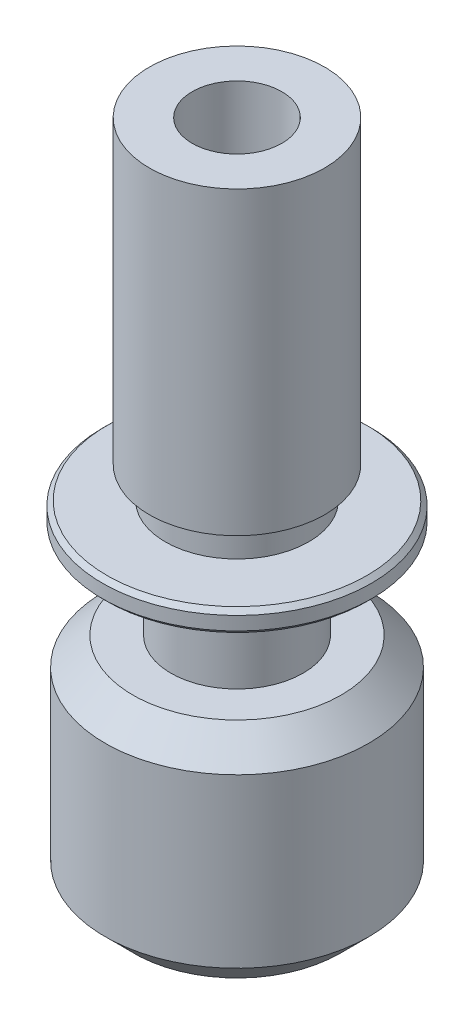
ISO-10303-21;
HEADER;
FILE_DESCRIPTION(('STEP AP214'),'2;1');
FILE_NAME('part.step','',(''),(''),'','','');
FILE_SCHEMA(('AUTOMOTIVE_DESIGN { 1 0 10303 214 1 1 1 1 }'));
ENDSEC;
DATA;
#1=APPLICATION_CONTEXT('core data for automotive mechanical design processes');
#2=APPLICATION_PROTOCOL_DEFINITION('international standard','automotive_design',2000,#1);
#3=PRODUCT_CONTEXT('',#1,'mechanical');
#4=PRODUCT('Part','Part','',(#3));
#5=PRODUCT_RELATED_PRODUCT_CATEGORY('part','',(#4));
#6=PRODUCT_DEFINITION_FORMATION('','',#4);
#7=PRODUCT_DEFINITION_CONTEXT('part definition',#1,'design');
#8=PRODUCT_DEFINITION('design','',#6,#7);
#9=PRODUCT_DEFINITION_SHAPE('','',#8);
#10=(LENGTH_UNIT() NAMED_UNIT(*) SI_UNIT(.MILLI.,.METRE.));
#11=(NAMED_UNIT(*) PLANE_ANGLE_UNIT() SI_UNIT($,.RADIAN.));
#12=(NAMED_UNIT(*) SI_UNIT($,.STERADIAN.) SOLID_ANGLE_UNIT());
#13=UNCERTAINTY_MEASURE_WITH_UNIT(LENGTH_MEASURE(1.E-05),#10,'distance_accuracy_value','');
#14=(GEOMETRIC_REPRESENTATION_CONTEXT(3) GLOBAL_UNCERTAINTY_ASSIGNED_CONTEXT((#13)) GLOBAL_UNIT_ASSIGNED_CONTEXT((#10,
#11,#12)) REPRESENTATION_CONTEXT('',''));
#15=CARTESIAN_POINT('',(0.,0.,0.));
#16=DIRECTION('',(0.,0.,1.));
#17=DIRECTION('',(1.,0.,0.));
#18=AXIS2_PLACEMENT_3D('',#15,#16,#17);
#19=CARTESIAN_POINT('',(1.47500000781805,7.0999999966966,0.));
#20=DIRECTION('',(-1.10113363038104E-09,-1.,0.));
#21=DIRECTION('',(1.,-1.10113363038104E-09,0.));
#22=AXIS2_PLACEMENT_3D('',#19,#20,#21);
#23=PLANE('',#22);
#24=CARTESIAN_POINT('',(7.81804540724686E-09,7.09999999832076,0.));
#25=DIRECTION('',(-1.10113363038104E-09,-1.,0.));
#26=DIRECTION('',(1.,-1.10113363038104E-09,0.));
#27=AXIS2_PLACEMENT_3D('',#24,#25,#26);
#28=CIRCLE('',#27,1.47500000115619);
#29=CARTESIAN_POINT('',(1.47500000897424,7.09999999669659,0.));
#30=VERTEX_POINT('',#29);
#31=EDGE_CURVE('E63',#30,#30,#28,.T.);
#32=ORIENTED_EDGE('',*,*,#31,.F.);
#33=EDGE_LOOP('',(#32));
#34=FACE_BOUND('',#33,.T.);
#35=CARTESIAN_POINT('',(7.81804646881799E-09,7.09999999832138,0.));
#36=DIRECTION('',(1.10113394113498E-09,1.,0.));
#37=DIRECTION('',(-1.,1.10113394113498E-09,0.));
#38=AXIS2_PLACEMENT_3D('',#35,#36,#37);
#39=CIRCLE('',#38,2.89999999987097);
#40=CARTESIAN_POINT('',(-2.89999999205293,7.10000000151467,0.));
#41=VERTEX_POINT('',#40);
#42=EDGE_CURVE('E17',#41,#41,#39,.T.);
#43=ORIENTED_EDGE('',*,*,#42,.F.);
#44=EDGE_LOOP('',(#43));
#45=FACE_BOUND('',#44,.T.);
#46=ADVANCED_FACE('F14',(#34,#45),#23,.T.);
#47=CARTESIAN_POINT('',(7.92815986472295E-09,7.19999999994831,0.));
#48=DIRECTION('',(1.10113394113498E-09,1.,0.));
#49=DIRECTION('',(-1.,1.10113394113498E-09,0.));
#50=AXIS2_PLACEMENT_3D('',#47,#48,#49);
#51=CONICAL_SURFACE('',#50,2.99999999955808,0.785398153698332);
#52=CARTESIAN_POINT('',(7.92815891391399E-09,7.200000000062,0.));
#53=DIRECTION('',(-1.10113363038104E-09,-1.,0.));
#54=DIRECTION('',(1.,-1.10113363038104E-09,0.));
#55=AXIS2_PLACEMENT_3D('',#52,#53,#54);
#56=CIRCLE('',#55,2.99999999972472);
#57=CARTESIAN_POINT('',(3.00000000765288,7.1999999967586,0.));
#58=VERTEX_POINT('',#57);
#59=EDGE_CURVE('E31',#58,#58,#56,.F.);
#60=ORIENTED_EDGE('',*,*,#59,.F.);
#61=EDGE_LOOP('',(#60));
#62=FACE_BOUND('',#61,.T.);
#63=ORIENTED_EDGE('',*,*,#42,.T.);
#64=EDGE_LOOP('',(#63));
#65=FACE_BOUND('',#64,.T.);
#66=ADVANCED_FACE('F71',(#62,#65),#51,.T.);
#67=CARTESIAN_POINT('',(6.66185509534678E-09,6.04999999832077,0.));
#68=DIRECTION('',(-1.10113363038104E-09,-1.,0.));
#69=DIRECTION('',(1.,-1.10113363038104E-09,0.));
#70=AXIS2_PLACEMENT_3D('',#67,#68,#69);
#71=CYLINDRICAL_SURFACE('',#70,1.47500000115619);
#72=ORIENTED_EDGE('',*,*,#31,.T.);
#73=EDGE_LOOP('',(#72));
#74=FACE_BOUND('',#73,.T.);
#75=CARTESIAN_POINT('',(5.5056647834467E-09,4.99999999832078,0.));
#76=DIRECTION('',(-1.10113363038104E-09,-1.,0.));
#77=DIRECTION('',(1.,-1.10113363038104E-09,0.));
#78=AXIS2_PLACEMENT_3D('',#75,#76,#77);
#79=CIRCLE('',#78,1.47500000115619);
#80=CARTESIAN_POINT('',(1.47500000666185,4.99999999669661,0.));
#81=VERTEX_POINT('',#80);
#82=EDGE_CURVE('E61',#81,#81,#79,.T.);
#83=ORIENTED_EDGE('',*,*,#82,.F.);
#84=EDGE_LOOP('',(#83));
#85=FACE_BOUND('',#84,.T.);
#86=ADVANCED_FACE('F79',(#74,#85),#71,.T.);
#87=CARTESIAN_POINT('',(8.09332895840287E-09,7.34999999999999,0.));
#88=DIRECTION('',(-1.10113363038104E-09,-1.,0.));
#89=DIRECTION('',(1.,-1.10113363038104E-09,0.));
#90=AXIS2_PLACEMENT_3D('',#87,#88,#89);
#91=CYLINDRICAL_SURFACE('',#90,2.99999999972472);
#92=ORIENTED_EDGE('',*,*,#59,.T.);
#93=EDGE_LOOP('',(#92));
#94=FACE_BOUND('',#93,.T.);
#95=CARTESIAN_POINT('',(8.2585049908515E-09,7.49999999988598,0.));
#96=DIRECTION('',(-1.101133941276E-09,-1.,0.));
#97=DIRECTION('',(1.,-1.1011339412134E-09,0.));
#98=AXIS2_PLACEMENT_3D('',#95,#96,#97);
#99=CIRCLE('',#98,2.99999999934442);
#100=CARTESIAN_POINT('',(3.00000000760292,7.49999999658257,0.));
#101=VERTEX_POINT('',#100);
#102=EDGE_CURVE('E60',#101,#101,#99,.F.);
#103=ORIENTED_EDGE('',*,*,#102,.F.);
#104=EDGE_LOOP('',(#103));
#105=FACE_BOUND('',#104,.T.);
#106=ADVANCED_FACE('F136',(#94,#105),#91,.T.);
#107=CARTESIAN_POINT('',(3.00000000550567,4.99999999669663,0.));
#108=DIRECTION('',(1.10113363038104E-09,1.,0.));
#109=DIRECTION('',(-1.,1.10113363038104E-09,0.));
#110=AXIS2_PLACEMENT_3D('',#107,#108,#109);
#111=PLANE('',#110);
#112=ORIENTED_EDGE('',*,*,#82,.T.);
#113=EDGE_LOOP('',(#112));
#114=FACE_BOUND('',#113,.T.);
#115=CARTESIAN_POINT('',(5.50566592723126E-09,5.00000000027855,0.));
#116=DIRECTION('',(-1.10113341557123E-09,-1.,0.));
#117=DIRECTION('',(1.,-1.10113341557123E-09,0.));
#118=AXIS2_PLACEMENT_3D('',#115,#116,#117);
#119=CIRCLE('',#118,2.32199999988684);
#120=CARTESIAN_POINT('',(2.32200000539251,4.99999999772172,0.));
#121=VERTEX_POINT('',#120);
#122=EDGE_CURVE('E57',#121,#121,#119,.T.);
#123=ORIENTED_EDGE('',*,*,#122,.F.);
#124=EDGE_LOOP('',(#123));
#125=FACE_BOUND('',#124,.T.);
#126=ADVANCED_FACE('F132',(#114,#125),#111,.T.);
#127=CARTESIAN_POINT('',(8.25850499097669E-09,7.49999999999966,0.));
#128=DIRECTION('',(-1.10113394125513E-09,-1.,0.));
#129=DIRECTION('',(1.,-1.10113394125513E-09,0.));
#130=AXIS2_PLACEMENT_3D('',#127,#128,#129);
#131=CONICAL_SURFACE('',#130,2.99999999923073,0.785398163361713);
#132=ORIENTED_EDGE('',*,*,#102,.T.);
#133=EDGE_LOOP('',(#132));
#134=FACE_BOUND('',#133,.T.);
#135=CARTESIAN_POINT('',(8.36861838521475E-09,7.60000000010188,0.));
#136=DIRECTION('',(-1.10113394125513E-09,-1.,0.));
#137=DIRECTION('',(1.,-1.10113394125513E-09,0.));
#138=AXIS2_PLACEMENT_3D('',#135,#136,#137);
#139=CIRCLE('',#138,2.89999999913566);
#140=CARTESIAN_POINT('',(2.90000000750428,7.59999999690859,0.));
#141=VERTEX_POINT('',#140);
#142=EDGE_CURVE('E54',#141,#141,#139,.F.);
#143=ORIENTED_EDGE('',*,*,#142,.F.);
#144=EDGE_LOOP('',(#143));
#145=FACE_BOUND('',#144,.T.);
#146=ADVANCED_FACE('F128',(#134,#145),#131,.T.);
#147=CARTESIAN_POINT('',(4.82296320936104E-09,4.38000000008233,0.));
#148=DIRECTION('',(-1.10113341557123E-09,-1.,0.));
#149=DIRECTION('',(1.,-1.10113341557123E-09,0.));
#150=AXIS2_PLACEMENT_3D('',#147,#148,#149);
#151=CONICAL_SURFACE('',#150,2.94200000008422,0.785398163398387);
#152=CARTESIAN_POINT('',(4.82296824595266E-09,4.38,0.));
#153=DIRECTION('',(-1.10113363038104E-09,-1.,0.));
#154=DIRECTION('',(1.,-1.10113363038104E-09,0.));
#155=AXIS2_PLACEMENT_3D('',#152,#153,#154);
#156=CIRCLE('',#155,2.942);
#157=CARTESIAN_POINT('',(2.94200000482297,4.37999999676046,0.));
#158=VERTEX_POINT('',#157);
#159=EDGE_CURVE('E53',#158,#158,#156,.T.);
#160=ORIENTED_EDGE('',*,*,#159,.F.);
#161=EDGE_LOOP('',(#160));
#162=FACE_BOUND('',#161,.T.);
#163=ORIENTED_EDGE('',*,*,#122,.T.);
#164=EDGE_LOOP('',(#163));
#165=FACE_BOUND('',#164,.T.);
#166=ADVANCED_FACE('F124',(#162,#165),#151,.T.);
#167=CARTESIAN_POINT('',(3.00000000781804,7.59999999669658,0.));
#168=DIRECTION('',(1.10113363038104E-09,1.,0.));
#169=DIRECTION('',(-1.,1.10113363038104E-09,0.));
#170=AXIS2_PLACEMENT_3D('',#167,#168,#169);
#171=PLANE('',#170);
#172=CARTESIAN_POINT('',(8.36861207343894E-09,7.59999999999998,0.));
#173=DIRECTION('',(-1.10113351180151E-09,-1.,0.));
#174=DIRECTION('',(1.,-1.10113351180151E-09,0.));
#175=AXIS2_PLACEMENT_3D('',#172,#173,#174);
#176=CIRCLE('',#175,1.59999997462941);
#177=CARTESIAN_POINT('',(1.59999998299802,7.59999999823817,0.));
#178=VERTEX_POINT('',#177);
#179=EDGE_CURVE('E50',#178,#178,#176,.F.);
#180=ORIENTED_EDGE('',*,*,#179,.F.);
#181=EDGE_LOOP('',(#180));
#182=FACE_BOUND('',#181,.T.);
#183=ORIENTED_EDGE('',*,*,#142,.T.);
#184=EDGE_LOOP('',(#183));
#185=FACE_BOUND('',#184,.T.);
#186=ADVANCED_FACE('F120',(#182,#185),#171,.T.);
#187=CARTESIAN_POINT('',(2.75283702083629E-09,2.49999999999998,0.));
#188=DIRECTION('',(-1.10113363038104E-09,-1.,0.));
#189=DIRECTION('',(1.,-1.10113363038104E-09,0.));
#190=AXIS2_PLACEMENT_3D('',#187,#188,#189);
#191=CYLINDRICAL_SURFACE('',#190,2.942);
#192=CARTESIAN_POINT('',(7.06931041545709E-10,0.6419999966175,0.));
#193=DIRECTION('',(1.10113363676564E-09,1.,0.));
#194=DIRECTION('',(-1.,1.10113356303925E-09,0.));
#195=AXIS2_PLACEMENT_3D('',#192,#193,#194);
#196=CIRCLE('',#195,2.94199999992978);
#197=CARTESIAN_POINT('',(-2.94199999922284,0.641999999857035,0.));
#198=VERTEX_POINT('',#197);
#199=EDGE_CURVE('E49',#198,#198,#196,.F.);
#200=ORIENTED_EDGE('',*,*,#199,.F.);
#201=EDGE_LOOP('',(#200));
#202=FACE_BOUND('',#201,.T.);
#203=ORIENTED_EDGE('',*,*,#159,.T.);
#204=EDGE_LOOP('',(#203));
#205=FACE_BOUND('',#204,.T.);
#206=ADVANCED_FACE('F116',(#202,#205),#191,.T.);
#207=CARTESIAN_POINT('',(8.75400880256949E-09,7.95,0.));
#208=DIRECTION('',(-1.10113351180151E-09,-1.,0.));
#209=DIRECTION('',(1.,-1.10113351180151E-09,0.));
#210=AXIS2_PLACEMENT_3D('',#207,#208,#209);
#211=CYLINDRICAL_SURFACE('',#210,1.59999997462941);
#212=ORIENTED_EDGE('',*,*,#179,.T.);
#213=EDGE_LOOP('',(#212));
#214=FACE_BOUND('',#213,.T.);
#215=CARTESIAN_POINT('',(9.13940553170002E-09,8.3,0.));
#216=DIRECTION('',(-1.10113351180151E-09,-1.,0.));
#217=DIRECTION('',(1.,-1.10113351180151E-09,0.));
#218=AXIS2_PLACEMENT_3D('',#215,#216,#217);
#219=CIRCLE('',#218,1.59999997462941);
#220=CARTESIAN_POINT('',(1.59999998376882,8.29999999823819,0.));
#221=VERTEX_POINT('',#220);
#222=EDGE_CURVE('E46',#221,#221,#219,.T.);
#223=ORIENTED_EDGE('',*,*,#222,.T.);
#224=EDGE_LOOP('',(#223));
#225=FACE_BOUND('',#224,.T.);
#226=ADVANCED_FACE('F112',(#214,#225),#211,.T.);
#227=CARTESIAN_POINT('',(7.06931041483116E-10,0.641999996560656,0.));
#228=DIRECTION('',(1.10113363676564E-09,1.,0.));
#229=DIRECTION('',(-1.,1.10113363676564E-09,0.));
#230=AXIS2_PLACEMENT_3D('',#227,#228,#229);
#231=CONICAL_SURFACE('',#230,2.94199999987293,0.785398161443912);
#232=ORIENTED_EDGE('',*,*,#199,.T.);
#233=EDGE_LOOP('',(#232));
#234=FACE_BOUND('',#233,.T.);
#235=CARTESIAN_POINT('',(0.,-2.90367556388116E-10,0.));
#236=DIRECTION('',(1.10113363676564E-09,1.,0.));
#237=DIRECTION('',(-1.,1.10113363676564E-09,0.));
#238=AXIS2_PLACEMENT_3D('',#235,#236,#237);
#239=CIRCLE('',#238,2.30000000553025);
#240=CARTESIAN_POINT('',(-2.30000000553024,2.2422398142624E-09,0.));
#241=VERTEX_POINT('',#240);
#242=EDGE_CURVE('E42',#241,#241,#239,.F.);
#243=ORIENTED_EDGE('',*,*,#242,.F.);
#244=EDGE_LOOP('',(#243));
#245=FACE_BOUND('',#244,.T.);
#246=ADVANCED_FACE('F108',(#234,#245),#231,.T.);
#247=CARTESIAN_POINT('',(2.90000000781806,8.29999999680671,0.));
#248=DIRECTION('',(1.10113351180151E-09,1.,0.));
#249=DIRECTION('',(-1.,1.10113351180151E-09,0.));
#250=AXIS2_PLACEMENT_3D('',#247,#248,#249);
#251=PLANE('',#250);
#252=ORIENTED_EDGE('',*,*,#222,.F.);
#253=EDGE_LOOP('',(#252));
#254=FACE_BOUND('',#253,.T.);
#255=CARTESIAN_POINT('',(9.1394127900651E-09,8.29999999999999,0.));
#256=DIRECTION('',(-1.10113363038104E-09,-1.,0.));
#257=DIRECTION('',(1.,-1.10113363038104E-09,0.));
#258=AXIS2_PLACEMENT_3D('',#255,#256,#257);
#259=CIRCLE('',#258,1.954);
#260=CARTESIAN_POINT('',(1.95400000913941,8.29999999784837,0.));
#261=VERTEX_POINT('',#260);
#262=EDGE_CURVE('E39',#261,#261,#259,.F.);
#263=ORIENTED_EDGE('',*,*,#262,.F.);
#264=EDGE_LOOP('',(#263));
#265=FACE_BOUND('',#264,.T.);
#266=ADVANCED_FACE('F104',(#254,#265),#251,.F.);
#267=CARTESIAN_POINT('',(1.00000001478517,-1.10116082918665E-09,0.));
#268=DIRECTION('',(-1.10113363038104E-09,-1.,0.));
#269=DIRECTION('',(1.,-1.10113363038104E-09,0.));
#270=AXIS2_PLACEMENT_3D('',#267,#268,#269);
#271=PLANE('',#270);
#272=CARTESIAN_POINT('',(0.,-2.11625196955021E-10,0.));
#273=DIRECTION('',(-1.10113363038103E-09,-1.,0.));
#274=DIRECTION('',(1.,-1.10113363038103E-09,0.));
#275=AXIS2_PLACEMENT_3D('',#272,#273,#274);
#276=CIRCLE('',#275,1.15000001471799);
#277=CARTESIAN_POINT('',(1.15000001471799,-1.47792888809968E-09,0.));
#278=VERTEX_POINT('',#277);
#279=EDGE_CURVE('E35',#278,#278,#276,.F.);
#280=ORIENTED_EDGE('',*,*,#279,.T.);
#281=EDGE_LOOP('',(#280));
#282=FACE_BOUND('',#281,.T.);
#283=ORIENTED_EDGE('',*,*,#242,.T.);
#284=EDGE_LOOP('',(#283));
#285=FACE_BOUND('',#284,.T.);
#286=ADVANCED_FACE('F100',(#282,#285),#271,.T.);
#287=CARTESIAN_POINT('',(1.84990486470915E-08,16.7999999988989,0.));
#288=DIRECTION('',(-1.10113363038104E-09,-1.,0.));
#289=DIRECTION('',(1.,-1.10113363038104E-09,0.));
#290=AXIS2_PLACEMENT_3D('',#287,#288,#289);
#291=CYLINDRICAL_SURFACE('',#290,1.954);
#292=ORIENTED_EDGE('',*,*,#262,.T.);
#293=EDGE_LOOP('',(#292));
#294=FACE_BOUND('',#293,.T.);
#295=CARTESIAN_POINT('',(1.65170081112489E-08,14.9999999978484,0.));
#296=DIRECTION('',(-1.10113363038104E-09,-1.,0.));
#297=DIRECTION('',(1.,-1.10113363038104E-09,0.));
#298=AXIS2_PLACEMENT_3D('',#295,#296,#297);
#299=CIRCLE('',#298,1.954);
#300=CARTESIAN_POINT('',(1.95400001651701,14.9999999956968,0.));
#301=VERTEX_POINT('',#300);
#302=EDGE_CURVE('E27',#301,#301,#299,.F.);
#303=ORIENTED_EDGE('',*,*,#302,.F.);
#304=EDGE_LOOP('',(#303));
#305=FACE_BOUND('',#304,.T.);
#306=ADVANCED_FACE('F96',(#294,#305),#291,.T.);
#307=CARTESIAN_POINT('',(0.,-1.54781780438137E-10,0.));
#308=DIRECTION('',(-1.10113363038103E-09,-1.,0.));
#309=DIRECTION('',(1.,-1.10113363038103E-09,0.));
#310=AXIS2_PLACEMENT_3D('',#307,#308,#309);
#311=CONICAL_SURFACE('',#310,1.15000001466115,0.785398184014822);
#312=CARTESIAN_POINT('',(1.6517321549423E-10,0.14999999999997,0.));
#313=DIRECTION('',(-1.10113363038104E-09,-1.,0.));
#314=DIRECTION('',(1.,-1.10113363038104E-09,0.));
#315=AXIS2_PLACEMENT_3D('',#312,#313,#314);
#316=CIRCLE('',#315,1.0000000086156);
#317=CARTESIAN_POINT('',(1.00000000878077,0.149999998898836,0.));
#318=VERTEX_POINT('',#317);
#319=EDGE_CURVE('E21',#318,#318,#316,.F.);
#320=ORIENTED_EDGE('',*,*,#319,.T.);
#321=EDGE_LOOP('',(#320));
#322=FACE_BOUND('',#321,.T.);
#323=ORIENTED_EDGE('',*,*,#279,.F.);
#324=EDGE_LOOP('',(#323));
#325=FACE_BOUND('',#324,.T.);
#326=ADVANCED_FACE('F89',(#322,#325),#311,.F.);
#327=CARTESIAN_POINT('',(0.,15.,0.));
#328=DIRECTION('',(0.,1.,0.));
#329=DIRECTION('',(0.,0.,1.));
#330=AXIS2_PLACEMENT_3D('',#327,#328,#329);
#331=PLANE('',#330);
#332=ORIENTED_EDGE('',*,*,#302,.T.);
#333=EDGE_LOOP('',(#332));
#334=FACE_BOUND('',#333,.T.);
#335=CARTESIAN_POINT('',(1.65170076278652E-08,15.0000000011011,0.));
#336=DIRECTION('',(-1.10113363038104E-09,-1.,0.));
#337=DIRECTION('',(1.,-1.10113363038104E-09,0.));
#338=AXIS2_PLACEMENT_3D('',#335,#336,#337);
#339=CIRCLE('',#338,1.0000000086156);
#340=CARTESIAN_POINT('',(1.00000002513261,15.,0.));
#341=VERTEX_POINT('',#340);
#342=EDGE_CURVE('E10',#341,#341,#339,.T.);
#343=ORIENTED_EDGE('',*,*,#342,.T.);
#344=EDGE_LOOP('',(#343));
#345=FACE_BOUND('',#344,.T.);
#346=ADVANCED_FACE('F83',(#334,#345),#331,.T.);
#347=CARTESIAN_POINT('',(1.43147403652844E-08,12.9999999994494,0.));
#348=DIRECTION('',(-1.10113363038104E-09,-1.,0.));
#349=DIRECTION('',(1.,-1.10113363038104E-09,0.));
#350=AXIS2_PLACEMENT_3D('',#347,#348,#349);
#351=CYLINDRICAL_SURFACE('',#350,1.0000000086156);
#352=ORIENTED_EDGE('',*,*,#342,.F.);
#353=EDGE_LOOP('',(#352));
#354=FACE_BOUND('',#353,.T.);
#355=ORIENTED_EDGE('',*,*,#319,.F.);
#356=EDGE_LOOP('',(#355));
#357=FACE_BOUND('',#356,.T.);
#358=ADVANCED_FACE('F81',(#354,#357),#351,.F.);
#359=CLOSED_SHELL('',(#46,#66,#86,#106,#126,#146,#166,#186,#206,#226,#246,#266,#286,#306,#326,
#346,#358));
#360=MANIFOLD_SOLID_BREP('B1',#359);
#361=ADVANCED_BREP_SHAPE_REPRESENTATION('',(#18,#360),#14);
#362=SHAPE_DEFINITION_REPRESENTATION(#9,#361);
ENDSEC;
END-ISO-10303-21;
